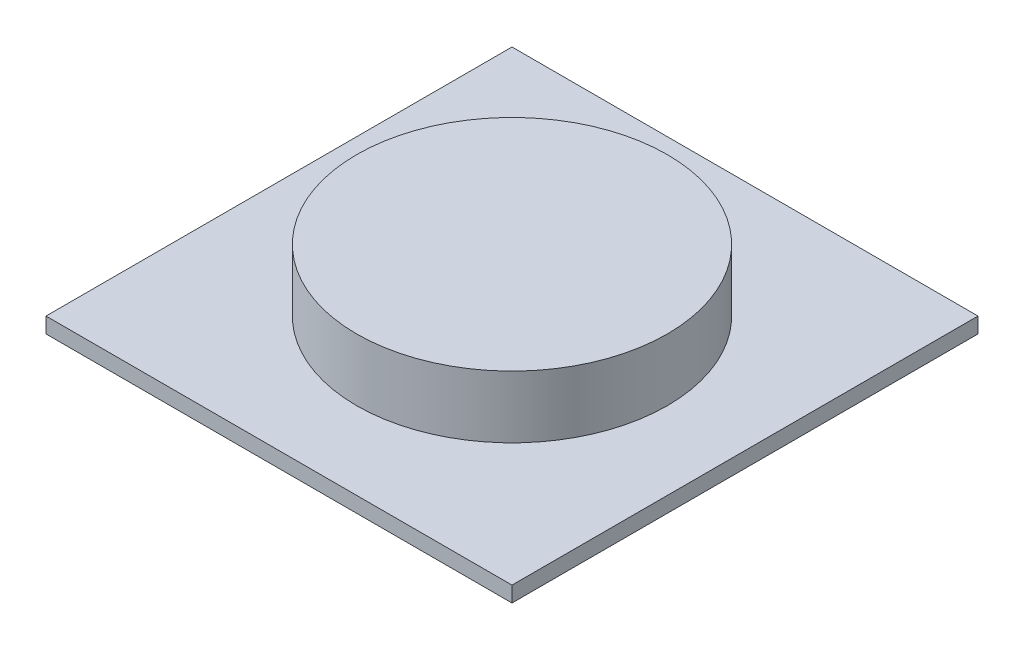
ISO-10303-21;
HEADER;
FILE_DESCRIPTION(('STEP AP214'),'2;1');
FILE_NAME('part.step','',(''),(''),'','','');
FILE_SCHEMA(('AUTOMOTIVE_DESIGN { 1 0 10303 214 1 1 1 1 }'));
ENDSEC;
DATA;
#1=APPLICATION_CONTEXT('core data for automotive mechanical design processes');
#2=APPLICATION_PROTOCOL_DEFINITION('international standard','automotive_design',2000,#1);
#3=PRODUCT_CONTEXT('',#1,'mechanical');
#4=PRODUCT('Part','Part','',(#3));
#5=PRODUCT_RELATED_PRODUCT_CATEGORY('part','',(#4));
#6=PRODUCT_DEFINITION_FORMATION('','',#4);
#7=PRODUCT_DEFINITION_CONTEXT('part definition',#1,'design');
#8=PRODUCT_DEFINITION('design','',#6,#7);
#9=PRODUCT_DEFINITION_SHAPE('','',#8);
#10=(LENGTH_UNIT() NAMED_UNIT(*) SI_UNIT(.MILLI.,.METRE.));
#11=(NAMED_UNIT(*) PLANE_ANGLE_UNIT() SI_UNIT($,.RADIAN.));
#12=(NAMED_UNIT(*) SI_UNIT($,.STERADIAN.) SOLID_ANGLE_UNIT());
#13=UNCERTAINTY_MEASURE_WITH_UNIT(LENGTH_MEASURE(1.E-05),#10,'distance_accuracy_value','');
#14=(GEOMETRIC_REPRESENTATION_CONTEXT(3) GLOBAL_UNCERTAINTY_ASSIGNED_CONTEXT((#13)) GLOBAL_UNIT_ASSIGNED_CONTEXT((#10,
#11,#12)) REPRESENTATION_CONTEXT('',''));
#15=CARTESIAN_POINT('',(0.,0.,0.));
#16=DIRECTION('',(0.,0.,1.));
#17=DIRECTION('',(1.,0.,0.));
#18=AXIS2_PLACEMENT_3D('',#15,#16,#17);
#19=CARTESIAN_POINT('',(37.5,2.5,37.5));
#20=DIRECTION('',(-1.,0.,0.));
#21=DIRECTION('',(0.,0.,1.));
#22=AXIS2_PLACEMENT_3D('',#19,#20,#21);
#23=PLANE('',#22);
#24=DIRECTION('',(0.,0.,-1.));
#25=VECTOR('',#24,1.);
#26=CARTESIAN_POINT('',(37.5,0.,37.5));
#27=LINE('',#26,#25);
#28=CARTESIAN_POINT('',(37.5,0.,37.5));
#29=VERTEX_POINT('',#28);
#30=CARTESIAN_POINT('',(37.5,0.,-37.5));
#31=VERTEX_POINT('',#30);
#32=EDGE_CURVE('E110',#29,#31,#27,.T.);
#33=ORIENTED_EDGE('',*,*,#32,.T.);
#34=DIRECTION('',(0.,-1.,0.));
#35=VECTOR('',#34,1.);
#36=CARTESIAN_POINT('',(37.5,2.5,-37.5));
#37=LINE('',#36,#35);
#38=CARTESIAN_POINT('',(37.5,2.5,-37.5));
#39=VERTEX_POINT('',#38);
#40=EDGE_CURVE('E42',#39,#31,#37,.T.);
#41=ORIENTED_EDGE('',*,*,#40,.F.);
#42=DIRECTION('',(0.,0.,-1.));
#43=VECTOR('',#42,1.);
#44=CARTESIAN_POINT('',(37.5,2.5,37.5));
#45=LINE('',#44,#43);
#46=CARTESIAN_POINT('',(37.5,2.5,37.5));
#47=VERTEX_POINT('',#46);
#48=EDGE_CURVE('E93',#47,#39,#45,.T.);
#49=ORIENTED_EDGE('',*,*,#48,.F.);
#50=DIRECTION('',(0.,-1.,0.));
#51=VECTOR('',#50,1.);
#52=CARTESIAN_POINT('',(37.5,2.5,37.5));
#53=LINE('',#52,#51);
#54=EDGE_CURVE('E106',#47,#29,#53,.T.);
#55=ORIENTED_EDGE('',*,*,#54,.T.);
#56=EDGE_LOOP('',(#33,#41,#49,#55));
#57=FACE_BOUND('',#56,.T.);
#58=ADVANCED_FACE('F39',(#57),#23,.F.);
#59=CARTESIAN_POINT('',(-37.5,2.5,-37.5));
#60=DIRECTION('',(0.,0.,1.));
#61=DIRECTION('',(1.,0.,0.));
#62=AXIS2_PLACEMENT_3D('',#59,#60,#61);
#63=PLANE('',#62);
#64=DIRECTION('',(-1.,0.,0.));
#65=VECTOR('',#64,1.);
#66=CARTESIAN_POINT('',(-37.5,0.,-37.5));
#67=LINE('',#66,#65);
#68=CARTESIAN_POINT('',(-37.5,0.,-37.5));
#69=VERTEX_POINT('',#68);
#70=EDGE_CURVE('E99',#31,#69,#67,.T.);
#71=ORIENTED_EDGE('',*,*,#70,.T.);
#72=DIRECTION('',(0.,-1.,0.));
#73=VECTOR('',#72,1.);
#74=CARTESIAN_POINT('',(-37.5,2.5,-37.5));
#75=LINE('',#74,#73);
#76=CARTESIAN_POINT('',(-37.5,2.5,-37.5));
#77=VERTEX_POINT('',#76);
#78=EDGE_CURVE('E97',#77,#69,#75,.T.);
#79=ORIENTED_EDGE('',*,*,#78,.F.);
#80=DIRECTION('',(-1.,0.,0.));
#81=VECTOR('',#80,1.);
#82=CARTESIAN_POINT('',(-37.5,2.5,-37.5));
#83=LINE('',#82,#81);
#84=EDGE_CURVE('E88',#39,#77,#83,.T.);
#85=ORIENTED_EDGE('',*,*,#84,.F.);
#86=ORIENTED_EDGE('',*,*,#40,.T.);
#87=EDGE_LOOP('',(#71,#79,#85,#86));
#88=FACE_BOUND('',#87,.T.);
#89=ADVANCED_FACE('F98',(#88),#63,.F.);
#90=CARTESIAN_POINT('',(-37.5,2.5,37.5));
#91=DIRECTION('',(1.,0.,0.));
#92=DIRECTION('',(0.,0.,-1.));
#93=AXIS2_PLACEMENT_3D('',#90,#91,#92);
#94=PLANE('',#93);
#95=DIRECTION('',(0.,0.,1.));
#96=VECTOR('',#95,1.);
#97=CARTESIAN_POINT('',(-37.5,0.,37.5));
#98=LINE('',#97,#96);
#99=CARTESIAN_POINT('',(-37.5,0.,37.5));
#100=VERTEX_POINT('',#99);
#101=EDGE_CURVE('E74',#69,#100,#98,.T.);
#102=ORIENTED_EDGE('',*,*,#101,.T.);
#103=DIRECTION('',(0.,-1.,0.));
#104=VECTOR('',#103,1.);
#105=CARTESIAN_POINT('',(-37.5,2.5,37.5));
#106=LINE('',#105,#104);
#107=CARTESIAN_POINT('',(-37.5,2.5,37.5));
#108=VERTEX_POINT('',#107);
#109=EDGE_CURVE('E101',#108,#100,#106,.T.);
#110=ORIENTED_EDGE('',*,*,#109,.F.);
#111=DIRECTION('',(0.,0.,1.));
#112=VECTOR('',#111,1.);
#113=CARTESIAN_POINT('',(-37.5,2.5,37.5));
#114=LINE('',#113,#112);
#115=EDGE_CURVE('E91',#77,#108,#114,.T.);
#116=ORIENTED_EDGE('',*,*,#115,.F.);
#117=ORIENTED_EDGE('',*,*,#78,.T.);
#118=EDGE_LOOP('',(#102,#110,#116,#117));
#119=FACE_BOUND('',#118,.T.);
#120=ADVANCED_FACE('F102',(#119),#94,.F.);
#121=CARTESIAN_POINT('',(-37.5,2.5,37.5));
#122=DIRECTION('',(0.,0.,-1.));
#123=DIRECTION('',(-1.,0.,0.));
#124=AXIS2_PLACEMENT_3D('',#121,#122,#123);
#125=PLANE('',#124);
#126=DIRECTION('',(1.,0.,0.));
#127=VECTOR('',#126,1.);
#128=CARTESIAN_POINT('',(-37.5,0.,37.5));
#129=LINE('',#128,#127);
#130=EDGE_CURVE('E80',#100,#29,#129,.T.);
#131=ORIENTED_EDGE('',*,*,#130,.T.);
#132=ORIENTED_EDGE('',*,*,#54,.F.);
#133=DIRECTION('',(1.,0.,0.));
#134=VECTOR('',#133,1.);
#135=CARTESIAN_POINT('',(-37.5,2.5,37.5));
#136=LINE('',#135,#134);
#137=EDGE_CURVE('E57',#108,#47,#136,.T.);
#138=ORIENTED_EDGE('',*,*,#137,.F.);
#139=ORIENTED_EDGE('',*,*,#109,.T.);
#140=EDGE_LOOP('',(#131,#132,#138,#139));
#141=FACE_BOUND('',#140,.T.);
#142=ADVANCED_FACE('F124',(#141),#125,.F.);
#143=CARTESIAN_POINT('',(0.,2.5,0.));
#144=DIRECTION('',(0.,-1.,0.));
#145=DIRECTION('',(0.,0.,-1.));
#146=AXIS2_PLACEMENT_3D('',#143,#144,#145);
#147=PLANE('',#146);
#148=CARTESIAN_POINT('',(0.,2.5,0.));
#149=DIRECTION('',(0.,1.,0.));
#150=DIRECTION('',(0.,0.,1.));
#151=AXIS2_PLACEMENT_3D('',#148,#149,#150);
#152=CIRCLE('',#151,25.);
#153=CARTESIAN_POINT('',(0.,2.5,25.));
#154=VERTEX_POINT('',#153);
#155=EDGE_CURVE('E11',#154,#154,#152,.T.);
#156=ORIENTED_EDGE('',*,*,#155,.F.);
#157=EDGE_LOOP('',(#156));
#158=FACE_BOUND('',#157,.T.);
#159=ORIENTED_EDGE('',*,*,#48,.T.);
#160=ORIENTED_EDGE('',*,*,#84,.T.);
#161=ORIENTED_EDGE('',*,*,#115,.T.);
#162=ORIENTED_EDGE('',*,*,#137,.T.);
#163=EDGE_LOOP('',(#159,#160,#161,#162));
#164=FACE_BOUND('',#163,.T.);
#165=ADVANCED_FACE('F89',(#158,#164),#147,.F.);
#166=CARTESIAN_POINT('',(0.,0.,0.));
#167=DIRECTION('',(0.,-1.,0.));
#168=DIRECTION('',(0.,0.,-1.));
#169=AXIS2_PLACEMENT_3D('',#166,#167,#168);
#170=PLANE('',#169);
#171=ORIENTED_EDGE('',*,*,#32,.F.);
#172=ORIENTED_EDGE('',*,*,#130,.F.);
#173=ORIENTED_EDGE('',*,*,#101,.F.);
#174=ORIENTED_EDGE('',*,*,#70,.F.);
#175=EDGE_LOOP('',(#171,#172,#173,#174));
#176=FACE_BOUND('',#175,.T.);
#177=ADVANCED_FACE('F127',(#176),#170,.T.);
#178=CARTESIAN_POINT('',(0.,12.5,0.));
#179=DIRECTION('',(0.,-1.,0.));
#180=DIRECTION('',(0.,0.,-1.));
#181=AXIS2_PLACEMENT_3D('',#178,#179,#180);
#182=CYLINDRICAL_SURFACE('',#181,25.);
#183=CARTESIAN_POINT('',(0.,12.5,0.));
#184=DIRECTION('',(0.,1.,0.));
#185=DIRECTION('',(0.,0.,1.));
#186=AXIS2_PLACEMENT_3D('',#183,#184,#185);
#187=CIRCLE('',#186,25.);
#188=CARTESIAN_POINT('',(0.,12.5,25.));
#189=VERTEX_POINT('',#188);
#190=EDGE_CURVE('E114',#189,#189,#187,.T.);
#191=ORIENTED_EDGE('',*,*,#190,.F.);
#192=EDGE_LOOP('',(#191));
#193=FACE_BOUND('',#192,.T.);
#194=ORIENTED_EDGE('',*,*,#155,.T.);
#195=EDGE_LOOP('',(#194));
#196=FACE_BOUND('',#195,.T.);
#197=ADVANCED_FACE('F137',(#193,#196),#182,.T.);
#198=CARTESIAN_POINT('',(0.,12.5,0.));
#199=DIRECTION('',(0.,1.,0.));
#200=DIRECTION('',(0.,0.,1.));
#201=AXIS2_PLACEMENT_3D('',#198,#199,#200);
#202=PLANE('',#201);
#203=ORIENTED_EDGE('',*,*,#190,.T.);
#204=EDGE_LOOP('',(#203));
#205=FACE_BOUND('',#204,.T.);
#206=ADVANCED_FACE('F135',(#205),#202,.T.);
#207=CLOSED_SHELL('',(#58,#89,#120,#142,#165,#177,#197,#206));
#208=MANIFOLD_SOLID_BREP('B2',#207);
#209=ADVANCED_BREP_SHAPE_REPRESENTATION('',(#18,#208),#14);
#210=SHAPE_DEFINITION_REPRESENTATION(#9,#209);
ENDSEC;
END-ISO-10303-21;
